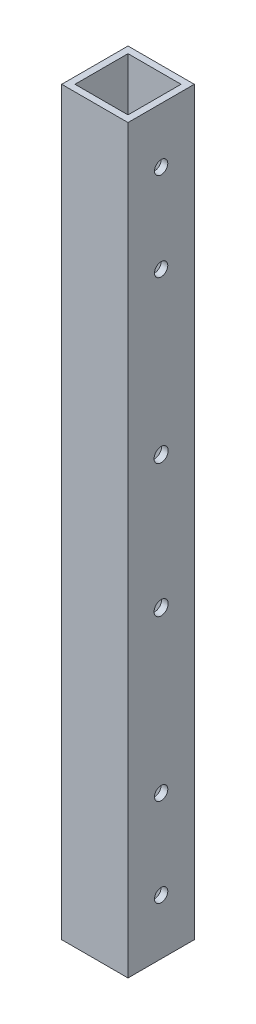
ISO-10303-21;
HEADER;
FILE_DESCRIPTION(('STEP AP214'),'2;1');
FILE_NAME('part.step','',(''),(''),'','','');
FILE_SCHEMA(('AUTOMOTIVE_DESIGN { 1 0 10303 214 1 1 1 1 }'));
ENDSEC;
DATA;
#1=APPLICATION_CONTEXT('core data for automotive mechanical design processes');
#2=APPLICATION_PROTOCOL_DEFINITION('international standard','automotive_design',2000,#1);
#3=PRODUCT_CONTEXT('',#1,'mechanical');
#4=PRODUCT('Part','Part','',(#3));
#5=PRODUCT_RELATED_PRODUCT_CATEGORY('part','',(#4));
#6=PRODUCT_DEFINITION_FORMATION('','',#4);
#7=PRODUCT_DEFINITION_CONTEXT('part definition',#1,'design');
#8=PRODUCT_DEFINITION('design','',#6,#7);
#9=PRODUCT_DEFINITION_SHAPE('','',#8);
#10=(LENGTH_UNIT() NAMED_UNIT(*) SI_UNIT(.MILLI.,.METRE.));
#11=(NAMED_UNIT(*) PLANE_ANGLE_UNIT() SI_UNIT($,.RADIAN.));
#12=(NAMED_UNIT(*) SI_UNIT($,.STERADIAN.) SOLID_ANGLE_UNIT());
#13=UNCERTAINTY_MEASURE_WITH_UNIT(LENGTH_MEASURE(1.E-05),#10,'distance_accuracy_value','');
#14=(GEOMETRIC_REPRESENTATION_CONTEXT(3) GLOBAL_UNCERTAINTY_ASSIGNED_CONTEXT((#13)) GLOBAL_UNIT_ASSIGNED_CONTEXT((#10,
#11,#12)) REPRESENTATION_CONTEXT('',''));
#15=CARTESIAN_POINT('',(0.,0.,0.));
#16=DIRECTION('',(0.,0.,1.));
#17=DIRECTION('',(1.,0.,0.));
#18=AXIS2_PLACEMENT_3D('',#15,#16,#17);
#19=CARTESIAN_POINT('',(0.,167.65,0.));
#20=DIRECTION('',(0.,-1.,0.));
#21=DIRECTION('',(0.,0.,-1.));
#22=AXIS2_PLACEMENT_3D('',#19,#20,#21);
#23=PLANE('',#22);
#24=DIRECTION('',(0.,0.,1.));
#25=VECTOR('',#24,1.);
#26=CARTESIAN_POINT('',(0.,167.65,0.));
#27=LINE('',#26,#25);
#28=CARTESIAN_POINT('',(0.,167.65,-15.));
#29=VERTEX_POINT('',#28);
#30=CARTESIAN_POINT('',(0.,167.65,0.));
#31=VERTEX_POINT('',#30);
#32=EDGE_CURVE('E150',#29,#31,#27,.T.);
#33=ORIENTED_EDGE('',*,*,#32,.T.);
#34=DIRECTION('',(1.,0.,0.));
#35=VECTOR('',#34,1.);
#36=CARTESIAN_POINT('',(0.,167.65,0.));
#37=LINE('',#36,#35);
#38=CARTESIAN_POINT('',(15.,167.65,0.));
#39=VERTEX_POINT('',#38);
#40=EDGE_CURVE('E153',#31,#39,#37,.T.);
#41=ORIENTED_EDGE('',*,*,#40,.T.);
#42=DIRECTION('',(0.,0.,-1.));
#43=VECTOR('',#42,1.);
#44=CARTESIAN_POINT('',(15.,167.65,0.));
#45=LINE('',#44,#43);
#46=CARTESIAN_POINT('',(15.,167.65,-15.));
#47=VERTEX_POINT('',#46);
#48=EDGE_CURVE('E156',#39,#47,#45,.T.);
#49=ORIENTED_EDGE('',*,*,#48,.T.);
#50=DIRECTION('',(-1.,0.,0.));
#51=VECTOR('',#50,1.);
#52=CARTESIAN_POINT('',(0.,167.65,-15.));
#53=LINE('',#52,#51);
#54=EDGE_CURVE('E158',#47,#29,#53,.T.);
#55=ORIENTED_EDGE('',*,*,#54,.T.);
#56=EDGE_LOOP('',(#33,#41,#49,#55));
#57=FACE_BOUND('',#56,.T.);
#58=DIRECTION('',(1.,0.,0.));
#59=VECTOR('',#58,1.);
#60=CARTESIAN_POINT('',(1.5,167.65,-1.5));
#61=LINE('',#60,#59);
#62=CARTESIAN_POINT('',(1.5,167.65,-1.5));
#63=VERTEX_POINT('',#62);
#64=CARTESIAN_POINT('',(13.5,167.65,-1.5));
#65=VERTEX_POINT('',#64);
#66=EDGE_CURVE('E112',#63,#65,#61,.T.);
#67=ORIENTED_EDGE('',*,*,#66,.F.);
#68=DIRECTION('',(0.,0.,1.));
#69=VECTOR('',#68,1.);
#70=CARTESIAN_POINT('',(1.5,167.65,-1.5));
#71=LINE('',#70,#69);
#72=CARTESIAN_POINT('',(1.5,167.65,-13.5));
#73=VERTEX_POINT('',#72);
#74=EDGE_CURVE('E134',#73,#63,#71,.T.);
#75=ORIENTED_EDGE('',*,*,#74,.F.);
#76=DIRECTION('',(-1.,0.,0.));
#77=VECTOR('',#76,1.);
#78=CARTESIAN_POINT('',(1.5,167.65,-13.5));
#79=LINE('',#78,#77);
#80=CARTESIAN_POINT('',(13.5,167.65,-13.5));
#81=VERTEX_POINT('',#80);
#82=EDGE_CURVE('E132',#81,#73,#79,.T.);
#83=ORIENTED_EDGE('',*,*,#82,.F.);
#84=DIRECTION('',(0.,0.,-1.));
#85=VECTOR('',#84,1.);
#86=CARTESIAN_POINT('',(13.5,167.65,-1.5));
#87=LINE('',#86,#85);
#88=EDGE_CURVE('E120',#65,#81,#87,.T.);
#89=ORIENTED_EDGE('',*,*,#88,.F.);
#90=EDGE_LOOP('',(#67,#75,#83,#89));
#91=FACE_BOUND('',#90,.T.);
#92=ADVANCED_FACE('F45',(#57,#91),#23,.F.);
#93=CARTESIAN_POINT('',(0.,0.,0.));
#94=DIRECTION('',(0.,-1.,0.));
#95=DIRECTION('',(0.,0.,-1.));
#96=AXIS2_PLACEMENT_3D('',#93,#94,#95);
#97=PLANE('',#96);
#98=DIRECTION('',(0.,0.,1.));
#99=VECTOR('',#98,1.);
#100=CARTESIAN_POINT('',(0.,0.,0.));
#101=LINE('',#100,#99);
#102=CARTESIAN_POINT('',(0.,0.,-15.));
#103=VERTEX_POINT('',#102);
#104=CARTESIAN_POINT('',(0.,0.,0.));
#105=VERTEX_POINT('',#104);
#106=EDGE_CURVE('E128',#103,#105,#101,.T.);
#107=ORIENTED_EDGE('',*,*,#106,.F.);
#108=DIRECTION('',(-1.,0.,0.));
#109=VECTOR('',#108,1.);
#110=CARTESIAN_POINT('',(0.,0.,-15.));
#111=LINE('',#110,#109);
#112=CARTESIAN_POINT('',(15.,0.,-15.));
#113=VERTEX_POINT('',#112);
#114=EDGE_CURVE('E154',#113,#103,#111,.T.);
#115=ORIENTED_EDGE('',*,*,#114,.F.);
#116=DIRECTION('',(0.,0.,-1.));
#117=VECTOR('',#116,1.);
#118=CARTESIAN_POINT('',(15.,0.,0.));
#119=LINE('',#118,#117);
#120=CARTESIAN_POINT('',(15.,0.,0.));
#121=VERTEX_POINT('',#120);
#122=EDGE_CURVE('E165',#121,#113,#119,.T.);
#123=ORIENTED_EDGE('',*,*,#122,.F.);
#124=DIRECTION('',(1.,0.,0.));
#125=VECTOR('',#124,1.);
#126=CARTESIAN_POINT('',(0.,0.,0.));
#127=LINE('',#126,#125);
#128=EDGE_CURVE('E163',#105,#121,#127,.T.);
#129=ORIENTED_EDGE('',*,*,#128,.F.);
#130=EDGE_LOOP('',(#107,#115,#123,#129));
#131=FACE_BOUND('',#130,.T.);
#132=DIRECTION('',(0.,0.,1.));
#133=VECTOR('',#132,1.);
#134=CARTESIAN_POINT('',(1.5,0.,-1.5));
#135=LINE('',#134,#133);
#136=CARTESIAN_POINT('',(1.5,0.,-13.5));
#137=VERTEX_POINT('',#136);
#138=CARTESIAN_POINT('',(1.5,0.,-1.5));
#139=VERTEX_POINT('',#138);
#140=EDGE_CURVE('E121',#137,#139,#135,.T.);
#141=ORIENTED_EDGE('',*,*,#140,.T.);
#142=DIRECTION('',(1.,0.,0.));
#143=VECTOR('',#142,1.);
#144=CARTESIAN_POINT('',(1.5,0.,-1.5));
#145=LINE('',#144,#143);
#146=CARTESIAN_POINT('',(13.5,0.,-1.5));
#147=VERTEX_POINT('',#146);
#148=EDGE_CURVE('E70',#139,#147,#145,.T.);
#149=ORIENTED_EDGE('',*,*,#148,.T.);
#150=DIRECTION('',(0.,0.,-1.));
#151=VECTOR('',#150,1.);
#152=CARTESIAN_POINT('',(13.5,0.,-1.5));
#153=LINE('',#152,#151);
#154=CARTESIAN_POINT('',(13.5,0.,-13.5));
#155=VERTEX_POINT('',#154);
#156=EDGE_CURVE('E127',#147,#155,#153,.T.);
#157=ORIENTED_EDGE('',*,*,#156,.T.);
#158=DIRECTION('',(-1.,0.,0.));
#159=VECTOR('',#158,1.);
#160=CARTESIAN_POINT('',(1.5,0.,-13.5));
#161=LINE('',#160,#159);
#162=EDGE_CURVE('E142',#155,#137,#161,.T.);
#163=ORIENTED_EDGE('',*,*,#162,.T.);
#164=EDGE_LOOP('',(#141,#149,#157,#163));
#165=FACE_BOUND('',#164,.T.);
#166=ADVANCED_FACE('F285',(#131,#165),#97,.T.);
#167=CARTESIAN_POINT('',(0.,167.65,0.));
#168=DIRECTION('',(1.,0.,0.));
#169=DIRECTION('',(0.,0.,-1.));
#170=AXIS2_PLACEMENT_3D('',#167,#168,#169);
#171=PLANE('',#170);
#172=CARTESIAN_POINT('',(0.,98.825,-7.49999999999998));
#173=DIRECTION('',(-1.,0.,0.));
#174=DIRECTION('',(0.,0.,1.));
#175=AXIS2_PLACEMENT_3D('',#172,#173,#174);
#176=CIRCLE('',#175,1.59999999999999);
#177=CARTESIAN_POINT('',(0.,98.825,-5.89999999999999));
#178=VERTEX_POINT('',#177);
#179=EDGE_CURVE('E199',#178,#178,#176,.T.);
#180=ORIENTED_EDGE('',*,*,#179,.F.);
#181=EDGE_LOOP('',(#180));
#182=FACE_BOUND('',#181,.T.);
#183=CARTESIAN_POINT('',(0.,68.825,-7.49999999999998));
#184=DIRECTION('',(-1.,0.,0.));
#185=DIRECTION('',(0.,0.,1.));
#186=AXIS2_PLACEMENT_3D('',#183,#184,#185);
#187=CIRCLE('',#186,1.59999999999999);
#188=CARTESIAN_POINT('',(0.,68.825,-5.89999999999999));
#189=VERTEX_POINT('',#188);
#190=EDGE_CURVE('E204',#189,#189,#187,.T.);
#191=ORIENTED_EDGE('',*,*,#190,.F.);
#192=EDGE_LOOP('',(#191));
#193=FACE_BOUND('',#192,.T.);
#194=CARTESIAN_POINT('',(0.,155.15,-7.50000000000201));
#195=DIRECTION('',(-1.,0.,0.));
#196=DIRECTION('',(0.,0.,1.));
#197=AXIS2_PLACEMENT_3D('',#194,#195,#196);
#198=CIRCLE('',#197,1.50000000000191);
#199=CARTESIAN_POINT('',(0.,155.15,-6.00000000000009));
#200=VERTEX_POINT('',#199);
#201=EDGE_CURVE('E218',#200,#200,#198,.T.);
#202=ORIENTED_EDGE('',*,*,#201,.F.);
#203=EDGE_LOOP('',(#202));
#204=FACE_BOUND('',#203,.T.);
#205=CARTESIAN_POINT('',(0.,135.15,-7.50000000000201));
#206=DIRECTION('',(-1.,0.,0.));
#207=DIRECTION('',(0.,0.,1.));
#208=AXIS2_PLACEMENT_3D('',#205,#206,#207);
#209=CIRCLE('',#208,1.50000000000191);
#210=CARTESIAN_POINT('',(0.,135.15,-6.0000000000001));
#211=VERTEX_POINT('',#210);
#212=EDGE_CURVE('E221',#211,#211,#209,.T.);
#213=ORIENTED_EDGE('',*,*,#212,.F.);
#214=EDGE_LOOP('',(#213));
#215=FACE_BOUND('',#214,.T.);
#216=CARTESIAN_POINT('',(0.,32.4999999999964,-7.50000000000201));
#217=DIRECTION('',(-1.,0.,0.));
#218=DIRECTION('',(0.,0.,1.));
#219=AXIS2_PLACEMENT_3D('',#216,#217,#218);
#220=CIRCLE('',#219,1.5);
#221=CARTESIAN_POINT('',(0.,32.4999999999964,-6.000000000002));
#222=VERTEX_POINT('',#221);
#223=EDGE_CURVE('E227',#222,#222,#220,.T.);
#224=ORIENTED_EDGE('',*,*,#223,.F.);
#225=EDGE_LOOP('',(#224));
#226=FACE_BOUND('',#225,.T.);
#227=CARTESIAN_POINT('',(0.,12.4999999999964,-7.50000000000201));
#228=DIRECTION('',(-1.,0.,0.));
#229=DIRECTION('',(0.,0.,1.));
#230=AXIS2_PLACEMENT_3D('',#227,#228,#229);
#231=CIRCLE('',#230,1.5);
#232=CARTESIAN_POINT('',(0.,12.4999999999964,-6.000000000002));
#233=VERTEX_POINT('',#232);
#234=EDGE_CURVE('E233',#233,#233,#231,.T.);
#235=ORIENTED_EDGE('',*,*,#234,.F.);
#236=EDGE_LOOP('',(#235));
#237=FACE_BOUND('',#236,.T.);
#238=ORIENTED_EDGE('',*,*,#106,.T.);
#239=DIRECTION('',(0.,-1.,0.));
#240=VECTOR('',#239,1.);
#241=CARTESIAN_POINT('',(0.,167.65,0.));
#242=LINE('',#241,#240);
#243=EDGE_CURVE('E11',#31,#105,#242,.T.);
#244=ORIENTED_EDGE('',*,*,#243,.F.);
#245=ORIENTED_EDGE('',*,*,#32,.F.);
#246=DIRECTION('',(0.,-1.,0.));
#247=VECTOR('',#246,1.);
#248=CARTESIAN_POINT('',(0.,167.65,-15.));
#249=LINE('',#248,#247);
#250=EDGE_CURVE('E160',#29,#103,#249,.T.);
#251=ORIENTED_EDGE('',*,*,#250,.T.);
#252=EDGE_LOOP('',(#238,#244,#245,#251));
#253=FACE_BOUND('',#252,.T.);
#254=ADVANCED_FACE('F47',(#182,#193,#204,#215,#226,#237,#253),#171,.F.);
#255=CARTESIAN_POINT('',(0.,167.65,0.));
#256=DIRECTION('',(0.,0.,-1.));
#257=DIRECTION('',(-1.,0.,0.));
#258=AXIS2_PLACEMENT_3D('',#255,#256,#257);
#259=PLANE('',#258);
#260=ORIENTED_EDGE('',*,*,#128,.T.);
#261=DIRECTION('',(0.,-1.,0.));
#262=VECTOR('',#261,1.);
#263=CARTESIAN_POINT('',(15.,167.65,0.));
#264=LINE('',#263,#262);
#265=EDGE_CURVE('E54',#39,#121,#264,.T.);
#266=ORIENTED_EDGE('',*,*,#265,.F.);
#267=ORIENTED_EDGE('',*,*,#40,.F.);
#268=ORIENTED_EDGE('',*,*,#243,.T.);
#269=EDGE_LOOP('',(#260,#266,#267,#268));
#270=FACE_BOUND('',#269,.T.);
#271=ADVANCED_FACE('F273',(#270),#259,.F.);
#272=CARTESIAN_POINT('',(15.,167.65,0.));
#273=DIRECTION('',(-1.,0.,0.));
#274=DIRECTION('',(0.,0.,1.));
#275=AXIS2_PLACEMENT_3D('',#272,#273,#274);
#276=PLANE('',#275);
#277=CARTESIAN_POINT('',(15.,98.825,-7.49999999999998));
#278=DIRECTION('',(-1.,0.,0.));
#279=DIRECTION('',(0.,0.,1.));
#280=AXIS2_PLACEMENT_3D('',#277,#278,#279);
#281=CIRCLE('',#280,1.59999999999999);
#282=CARTESIAN_POINT('',(15.,98.825,-5.89999999999999));
#283=VERTEX_POINT('',#282);
#284=EDGE_CURVE('E193',#283,#283,#281,.T.);
#285=ORIENTED_EDGE('',*,*,#284,.T.);
#286=EDGE_LOOP('',(#285));
#287=FACE_BOUND('',#286,.T.);
#288=CARTESIAN_POINT('',(15.,68.825,-7.49999999999998));
#289=DIRECTION('',(-1.,0.,0.));
#290=DIRECTION('',(0.,0.,1.));
#291=AXIS2_PLACEMENT_3D('',#288,#289,#290);
#292=CIRCLE('',#291,1.59999999999999);
#293=CARTESIAN_POINT('',(15.,68.825,-5.89999999999999));
#294=VERTEX_POINT('',#293);
#295=EDGE_CURVE('E209',#294,#294,#292,.T.);
#296=ORIENTED_EDGE('',*,*,#295,.T.);
#297=EDGE_LOOP('',(#296));
#298=FACE_BOUND('',#297,.T.);
#299=CARTESIAN_POINT('',(15.,155.15,-7.50000000000201));
#300=DIRECTION('',(-1.,0.,0.));
#301=DIRECTION('',(0.,0.,1.));
#302=AXIS2_PLACEMENT_3D('',#299,#300,#301);
#303=CIRCLE('',#302,1.50000000000191);
#304=CARTESIAN_POINT('',(15.,155.15,-6.00000000000009));
#305=VERTEX_POINT('',#304);
#306=EDGE_CURVE('E179',#305,#305,#303,.T.);
#307=ORIENTED_EDGE('',*,*,#306,.T.);
#308=EDGE_LOOP('',(#307));
#309=FACE_BOUND('',#308,.T.);
#310=CARTESIAN_POINT('',(15.,135.15,-7.50000000000201));
#311=DIRECTION('',(-1.,0.,0.));
#312=DIRECTION('',(0.,0.,1.));
#313=AXIS2_PLACEMENT_3D('',#310,#311,#312);
#314=CIRCLE('',#313,1.50000000000191);
#315=CARTESIAN_POINT('',(15.,135.15,-6.0000000000001));
#316=VERTEX_POINT('',#315);
#317=EDGE_CURVE('E224',#316,#316,#314,.T.);
#318=ORIENTED_EDGE('',*,*,#317,.T.);
#319=EDGE_LOOP('',(#318));
#320=FACE_BOUND('',#319,.T.);
#321=CARTESIAN_POINT('',(15.,32.4999999999964,-7.50000000000201));
#322=DIRECTION('',(-1.,0.,0.));
#323=DIRECTION('',(0.,0.,1.));
#324=AXIS2_PLACEMENT_3D('',#321,#322,#323);
#325=CIRCLE('',#324,1.5);
#326=CARTESIAN_POINT('',(15.,32.4999999999964,-6.000000000002));
#327=VERTEX_POINT('',#326);
#328=EDGE_CURVE('E230',#327,#327,#325,.T.);
#329=ORIENTED_EDGE('',*,*,#328,.T.);
#330=EDGE_LOOP('',(#329));
#331=FACE_BOUND('',#330,.T.);
#332=CARTESIAN_POINT('',(15.,12.4999999999964,-7.50000000000201));
#333=DIRECTION('',(-1.,0.,0.));
#334=DIRECTION('',(0.,0.,1.));
#335=AXIS2_PLACEMENT_3D('',#332,#333,#334);
#336=CIRCLE('',#335,1.5);
#337=CARTESIAN_POINT('',(15.,12.4999999999964,-6.000000000002));
#338=VERTEX_POINT('',#337);
#339=EDGE_CURVE('E215',#338,#338,#336,.T.);
#340=ORIENTED_EDGE('',*,*,#339,.T.);
#341=EDGE_LOOP('',(#340));
#342=FACE_BOUND('',#341,.T.);
#343=ORIENTED_EDGE('',*,*,#122,.T.);
#344=DIRECTION('',(0.,-1.,0.));
#345=VECTOR('',#344,1.);
#346=CARTESIAN_POINT('',(15.,167.65,-15.));
#347=LINE('',#346,#345);
#348=EDGE_CURVE('E170',#47,#113,#347,.T.);
#349=ORIENTED_EDGE('',*,*,#348,.F.);
#350=ORIENTED_EDGE('',*,*,#48,.F.);
#351=ORIENTED_EDGE('',*,*,#265,.T.);
#352=EDGE_LOOP('',(#343,#349,#350,#351));
#353=FACE_BOUND('',#352,.T.);
#354=ADVANCED_FACE('F269',(#287,#298,#309,#320,#331,#342,#353),#276,.F.);
#355=CARTESIAN_POINT('',(0.,167.65,-15.));
#356=DIRECTION('',(0.,0.,1.));
#357=DIRECTION('',(1.,0.,0.));
#358=AXIS2_PLACEMENT_3D('',#355,#356,#357);
#359=PLANE('',#358);
#360=ORIENTED_EDGE('',*,*,#114,.T.);
#361=ORIENTED_EDGE('',*,*,#250,.F.);
#362=ORIENTED_EDGE('',*,*,#54,.F.);
#363=ORIENTED_EDGE('',*,*,#348,.T.);
#364=EDGE_LOOP('',(#360,#361,#362,#363));
#365=FACE_BOUND('',#364,.T.);
#366=ADVANCED_FACE('F272',(#365),#359,.F.);
#367=CARTESIAN_POINT('',(1.5,167.65,-1.5));
#368=DIRECTION('',(0.,0.,-1.));
#369=DIRECTION('',(-1.,0.,0.));
#370=AXIS2_PLACEMENT_3D('',#367,#368,#369);
#371=PLANE('',#370);
#372=ORIENTED_EDGE('',*,*,#148,.F.);
#373=DIRECTION('',(0.,-1.,0.));
#374=VECTOR('',#373,1.);
#375=CARTESIAN_POINT('',(1.5,167.65,-1.5));
#376=LINE('',#375,#374);
#377=EDGE_CURVE('E116',#63,#139,#376,.T.);
#378=ORIENTED_EDGE('',*,*,#377,.F.);
#379=ORIENTED_EDGE('',*,*,#66,.T.);
#380=DIRECTION('',(0.,-1.,0.));
#381=VECTOR('',#380,1.);
#382=CARTESIAN_POINT('',(13.5,167.65,-1.5));
#383=LINE('',#382,#381);
#384=EDGE_CURVE('E115',#65,#147,#383,.T.);
#385=ORIENTED_EDGE('',*,*,#384,.T.);
#386=EDGE_LOOP('',(#372,#378,#379,#385));
#387=FACE_BOUND('',#386,.T.);
#388=ADVANCED_FACE('F114',(#387),#371,.T.);
#389=CARTESIAN_POINT('',(13.5,167.65,-1.5));
#390=DIRECTION('',(-1.,0.,0.));
#391=DIRECTION('',(0.,0.,1.));
#392=AXIS2_PLACEMENT_3D('',#389,#390,#391);
#393=PLANE('',#392);
#394=CARTESIAN_POINT('',(13.5,98.825,-7.49999999999998));
#395=DIRECTION('',(-1.,0.,0.));
#396=DIRECTION('',(0.,0.,1.));
#397=AXIS2_PLACEMENT_3D('',#394,#395,#396);
#398=CIRCLE('',#397,1.59999999999999);
#399=CARTESIAN_POINT('',(13.5,98.825,-5.89999999999999));
#400=VERTEX_POINT('',#399);
#401=EDGE_CURVE('E212',#400,#400,#398,.T.);
#402=ORIENTED_EDGE('',*,*,#401,.F.);
#403=EDGE_LOOP('',(#402));
#404=FACE_BOUND('',#403,.T.);
#405=CARTESIAN_POINT('',(13.5,68.825,-7.49999999999998));
#406=DIRECTION('',(-1.,0.,0.));
#407=DIRECTION('',(0.,0.,1.));
#408=AXIS2_PLACEMENT_3D('',#405,#406,#407);
#409=CIRCLE('',#408,1.59999999999999);
#410=CARTESIAN_POINT('',(13.5,68.825,-5.89999999999999));
#411=VERTEX_POINT('',#410);
#412=EDGE_CURVE('E192',#411,#411,#409,.T.);
#413=ORIENTED_EDGE('',*,*,#412,.F.);
#414=EDGE_LOOP('',(#413));
#415=FACE_BOUND('',#414,.T.);
#416=CARTESIAN_POINT('',(13.5,155.15,-7.50000000000201));
#417=DIRECTION('',(-1.,0.,0.));
#418=DIRECTION('',(0.,0.,1.));
#419=AXIS2_PLACEMENT_3D('',#416,#417,#418);
#420=CIRCLE('',#419,1.50000000000191);
#421=CARTESIAN_POINT('',(13.5,155.15,-6.00000000000009));
#422=VERTEX_POINT('',#421);
#423=EDGE_CURVE('E140',#422,#422,#420,.T.);
#424=ORIENTED_EDGE('',*,*,#423,.F.);
#425=EDGE_LOOP('',(#424));
#426=FACE_BOUND('',#425,.T.);
#427=CARTESIAN_POINT('',(13.5,135.15,-7.50000000000201));
#428=DIRECTION('',(-1.,0.,0.));
#429=DIRECTION('',(0.,0.,1.));
#430=AXIS2_PLACEMENT_3D('',#427,#428,#429);
#431=CIRCLE('',#430,1.50000000000191);
#432=CARTESIAN_POINT('',(13.5,135.15,-6.0000000000001));
#433=VERTEX_POINT('',#432);
#434=EDGE_CURVE('E187',#433,#433,#431,.T.);
#435=ORIENTED_EDGE('',*,*,#434,.F.);
#436=EDGE_LOOP('',(#435));
#437=FACE_BOUND('',#436,.T.);
#438=CARTESIAN_POINT('',(13.5,32.4999999999964,-7.50000000000201));
#439=DIRECTION('',(-1.,0.,0.));
#440=DIRECTION('',(0.,0.,1.));
#441=AXIS2_PLACEMENT_3D('',#438,#439,#440);
#442=CIRCLE('',#441,1.5);
#443=CARTESIAN_POINT('',(13.5,32.4999999999964,-6.000000000002));
#444=VERTEX_POINT('',#443);
#445=EDGE_CURVE('E183',#444,#444,#442,.T.);
#446=ORIENTED_EDGE('',*,*,#445,.F.);
#447=EDGE_LOOP('',(#446));
#448=FACE_BOUND('',#447,.T.);
#449=CARTESIAN_POINT('',(13.5,12.4999999999964,-7.50000000000201));
#450=DIRECTION('',(-1.,0.,0.));
#451=DIRECTION('',(0.,0.,1.));
#452=AXIS2_PLACEMENT_3D('',#449,#450,#451);
#453=CIRCLE('',#452,1.5);
#454=CARTESIAN_POINT('',(13.5,12.4999999999964,-6.000000000002));
#455=VERTEX_POINT('',#454);
#456=EDGE_CURVE('E178',#455,#455,#453,.T.);
#457=ORIENTED_EDGE('',*,*,#456,.F.);
#458=EDGE_LOOP('',(#457));
#459=FACE_BOUND('',#458,.T.);
#460=ORIENTED_EDGE('',*,*,#156,.F.);
#461=ORIENTED_EDGE('',*,*,#384,.F.);
#462=ORIENTED_EDGE('',*,*,#88,.T.);
#463=DIRECTION('',(0.,-1.,0.));
#464=VECTOR('',#463,1.);
#465=CARTESIAN_POINT('',(13.5,167.65,-13.5));
#466=LINE('',#465,#464);
#467=EDGE_CURVE('E129',#81,#155,#466,.T.);
#468=ORIENTED_EDGE('',*,*,#467,.T.);
#469=EDGE_LOOP('',(#460,#461,#462,#468));
#470=FACE_BOUND('',#469,.T.);
#471=ADVANCED_FACE('F124',(#404,#415,#426,#437,#448,#459,#470),#393,.T.);
#472=CARTESIAN_POINT('',(1.5,167.65,-13.5));
#473=DIRECTION('',(0.,0.,1.));
#474=DIRECTION('',(1.,0.,0.));
#475=AXIS2_PLACEMENT_3D('',#472,#473,#474);
#476=PLANE('',#475);
#477=ORIENTED_EDGE('',*,*,#162,.F.);
#478=ORIENTED_EDGE('',*,*,#467,.F.);
#479=ORIENTED_EDGE('',*,*,#82,.T.);
#480=DIRECTION('',(0.,-1.,0.));
#481=VECTOR('',#480,1.);
#482=CARTESIAN_POINT('',(1.5,167.65,-13.5));
#483=LINE('',#482,#481);
#484=EDGE_CURVE('E62',#73,#137,#483,.T.);
#485=ORIENTED_EDGE('',*,*,#484,.T.);
#486=EDGE_LOOP('',(#477,#478,#479,#485));
#487=FACE_BOUND('',#486,.T.);
#488=ADVANCED_FACE('F251',(#487),#476,.T.);
#489=CARTESIAN_POINT('',(1.5,167.65,-1.5));
#490=DIRECTION('',(1.,0.,0.));
#491=DIRECTION('',(0.,0.,-1.));
#492=AXIS2_PLACEMENT_3D('',#489,#490,#491);
#493=PLANE('',#492);
#494=CARTESIAN_POINT('',(1.5,98.825,-7.49999999999998));
#495=DIRECTION('',(1.,0.,0.));
#496=DIRECTION('',(0.,0.,-1.));
#497=AXIS2_PLACEMENT_3D('',#494,#495,#496);
#498=CIRCLE('',#497,1.59999999999999);
#499=CARTESIAN_POINT('',(1.5,98.825,-9.09999999999997));
#500=VERTEX_POINT('',#499);
#501=EDGE_CURVE('E49',#500,#500,#498,.T.);
#502=ORIENTED_EDGE('',*,*,#501,.F.);
#503=EDGE_LOOP('',(#502));
#504=FACE_BOUND('',#503,.T.);
#505=CARTESIAN_POINT('',(1.5,68.825,-7.49999999999998));
#506=DIRECTION('',(1.,0.,0.));
#507=DIRECTION('',(0.,0.,-1.));
#508=AXIS2_PLACEMENT_3D('',#505,#506,#507);
#509=CIRCLE('',#508,1.59999999999999);
#510=CARTESIAN_POINT('',(1.5,68.825,-9.09999999999997));
#511=VERTEX_POINT('',#510);
#512=EDGE_CURVE('E190',#511,#511,#509,.T.);
#513=ORIENTED_EDGE('',*,*,#512,.F.);
#514=EDGE_LOOP('',(#513));
#515=FACE_BOUND('',#514,.T.);
#516=CARTESIAN_POINT('',(1.5,155.15,-7.50000000000201));
#517=DIRECTION('',(1.,0.,0.));
#518=DIRECTION('',(0.,0.,-1.));
#519=AXIS2_PLACEMENT_3D('',#516,#517,#518);
#520=CIRCLE('',#519,1.50000000000191);
#521=CARTESIAN_POINT('',(1.5,155.15,-9.00000000000392));
#522=VERTEX_POINT('',#521);
#523=EDGE_CURVE('E188',#522,#522,#520,.T.);
#524=ORIENTED_EDGE('',*,*,#523,.F.);
#525=EDGE_LOOP('',(#524));
#526=FACE_BOUND('',#525,.T.);
#527=CARTESIAN_POINT('',(1.5,135.15,-7.50000000000201));
#528=DIRECTION('',(1.,0.,0.));
#529=DIRECTION('',(0.,0.,-1.));
#530=AXIS2_PLACEMENT_3D('',#527,#528,#529);
#531=CIRCLE('',#530,1.50000000000191);
#532=CARTESIAN_POINT('',(1.5,135.15,-9.00000000000391));
#533=VERTEX_POINT('',#532);
#534=EDGE_CURVE('E184',#533,#533,#531,.T.);
#535=ORIENTED_EDGE('',*,*,#534,.F.);
#536=EDGE_LOOP('',(#535));
#537=FACE_BOUND('',#536,.T.);
#538=CARTESIAN_POINT('',(1.5,32.4999999999964,-7.50000000000201));
#539=DIRECTION('',(1.,0.,0.));
#540=DIRECTION('',(0.,0.,-1.));
#541=AXIS2_PLACEMENT_3D('',#538,#539,#540);
#542=CIRCLE('',#541,1.5);
#543=CARTESIAN_POINT('',(1.5,32.4999999999964,-9.00000000000201));
#544=VERTEX_POINT('',#543);
#545=EDGE_CURVE('E180',#544,#544,#542,.T.);
#546=ORIENTED_EDGE('',*,*,#545,.F.);
#547=EDGE_LOOP('',(#546));
#548=FACE_BOUND('',#547,.T.);
#549=CARTESIAN_POINT('',(1.5,12.4999999999964,-7.50000000000201));
#550=DIRECTION('',(1.,0.,0.));
#551=DIRECTION('',(0.,0.,-1.));
#552=AXIS2_PLACEMENT_3D('',#549,#550,#551);
#553=CIRCLE('',#552,1.5);
#554=CARTESIAN_POINT('',(1.5,12.4999999999964,-9.00000000000201));
#555=VERTEX_POINT('',#554);
#556=EDGE_CURVE('E175',#555,#555,#553,.T.);
#557=ORIENTED_EDGE('',*,*,#556,.F.);
#558=EDGE_LOOP('',(#557));
#559=FACE_BOUND('',#558,.T.);
#560=ORIENTED_EDGE('',*,*,#140,.F.);
#561=ORIENTED_EDGE('',*,*,#484,.F.);
#562=ORIENTED_EDGE('',*,*,#74,.T.);
#563=ORIENTED_EDGE('',*,*,#377,.T.);
#564=EDGE_LOOP('',(#560,#561,#562,#563));
#565=FACE_BOUND('',#564,.T.);
#566=ADVANCED_FACE('F319',(#504,#515,#526,#537,#548,#559,#565),#493,.T.);
#567=CARTESIAN_POINT('',(15.,12.4999999999964,-7.50000000000201));
#568=DIRECTION('',(-1.,0.,0.));
#569=DIRECTION('',(0.,0.,1.));
#570=AXIS2_PLACEMENT_3D('',#567,#568,#569);
#571=CYLINDRICAL_SURFACE('',#570,1.5);
#572=ORIENTED_EDGE('',*,*,#556,.T.);
#573=EDGE_LOOP('',(#572));
#574=FACE_BOUND('',#573,.T.);
#575=ORIENTED_EDGE('',*,*,#234,.T.);
#576=EDGE_LOOP('',(#575));
#577=FACE_BOUND('',#576,.T.);
#578=ADVANCED_FACE('F266',(#574,#577),#571,.F.);
#579=CARTESIAN_POINT('',(15.,32.4999999999964,-7.50000000000201));
#580=DIRECTION('',(-1.,0.,0.));
#581=DIRECTION('',(0.,0.,1.));
#582=AXIS2_PLACEMENT_3D('',#579,#580,#581);
#583=CYLINDRICAL_SURFACE('',#582,1.5);
#584=ORIENTED_EDGE('',*,*,#545,.T.);
#585=EDGE_LOOP('',(#584));
#586=FACE_BOUND('',#585,.T.);
#587=ORIENTED_EDGE('',*,*,#223,.T.);
#588=EDGE_LOOP('',(#587));
#589=FACE_BOUND('',#588,.T.);
#590=ADVANCED_FACE('F329',(#586,#589),#583,.F.);
#591=CARTESIAN_POINT('',(15.,135.15,-7.50000000000201));
#592=DIRECTION('',(-1.,0.,0.));
#593=DIRECTION('',(0.,0.,1.));
#594=AXIS2_PLACEMENT_3D('',#591,#592,#593);
#595=CYLINDRICAL_SURFACE('',#594,1.50000000000191);
#596=ORIENTED_EDGE('',*,*,#534,.T.);
#597=EDGE_LOOP('',(#596));
#598=FACE_BOUND('',#597,.T.);
#599=ORIENTED_EDGE('',*,*,#212,.T.);
#600=EDGE_LOOP('',(#599));
#601=FACE_BOUND('',#600,.T.);
#602=ADVANCED_FACE('F337',(#598,#601),#595,.F.);
#603=CARTESIAN_POINT('',(15.,155.15,-7.50000000000201));
#604=DIRECTION('',(-1.,0.,0.));
#605=DIRECTION('',(0.,0.,1.));
#606=AXIS2_PLACEMENT_3D('',#603,#604,#605);
#607=CYLINDRICAL_SURFACE('',#606,1.50000000000191);
#608=ORIENTED_EDGE('',*,*,#523,.T.);
#609=EDGE_LOOP('',(#608));
#610=FACE_BOUND('',#609,.T.);
#611=ORIENTED_EDGE('',*,*,#201,.T.);
#612=EDGE_LOOP('',(#611));
#613=FACE_BOUND('',#612,.T.);
#614=ADVANCED_FACE('F264',(#610,#613),#607,.F.);
#615=ORIENTED_EDGE('',*,*,#456,.T.);
#616=EDGE_LOOP('',(#615));
#617=FACE_BOUND('',#616,.T.);
#618=ORIENTED_EDGE('',*,*,#339,.F.);
#619=EDGE_LOOP('',(#618));
#620=FACE_BOUND('',#619,.T.);
#621=ADVANCED_FACE('F260',(#617,#620),#571,.F.);
#622=ORIENTED_EDGE('',*,*,#445,.T.);
#623=EDGE_LOOP('',(#622));
#624=FACE_BOUND('',#623,.T.);
#625=ORIENTED_EDGE('',*,*,#328,.F.);
#626=EDGE_LOOP('',(#625));
#627=FACE_BOUND('',#626,.T.);
#628=ADVANCED_FACE('F263',(#624,#627),#583,.F.);
#629=ORIENTED_EDGE('',*,*,#434,.T.);
#630=EDGE_LOOP('',(#629));
#631=FACE_BOUND('',#630,.T.);
#632=ORIENTED_EDGE('',*,*,#317,.F.);
#633=EDGE_LOOP('',(#632));
#634=FACE_BOUND('',#633,.T.);
#635=ADVANCED_FACE('F348',(#631,#634),#595,.F.);
#636=ORIENTED_EDGE('',*,*,#423,.T.);
#637=EDGE_LOOP('',(#636));
#638=FACE_BOUND('',#637,.T.);
#639=ORIENTED_EDGE('',*,*,#306,.F.);
#640=EDGE_LOOP('',(#639));
#641=FACE_BOUND('',#640,.T.);
#642=ADVANCED_FACE('F246',(#638,#641),#607,.F.);
#643=CARTESIAN_POINT('',(15.,68.825,-7.49999999999998));
#644=DIRECTION('',(-1.,0.,0.));
#645=DIRECTION('',(0.,0.,1.));
#646=AXIS2_PLACEMENT_3D('',#643,#644,#645);
#647=CYLINDRICAL_SURFACE('',#646,1.59999999999999);
#648=ORIENTED_EDGE('',*,*,#512,.T.);
#649=EDGE_LOOP('',(#648));
#650=FACE_BOUND('',#649,.T.);
#651=ORIENTED_EDGE('',*,*,#190,.T.);
#652=EDGE_LOOP('',(#651));
#653=FACE_BOUND('',#652,.T.);
#654=ADVANCED_FACE('F381',(#650,#653),#647,.F.);
#655=CARTESIAN_POINT('',(15.,98.825,-7.49999999999998));
#656=DIRECTION('',(-1.,0.,0.));
#657=DIRECTION('',(0.,0.,1.));
#658=AXIS2_PLACEMENT_3D('',#655,#656,#657);
#659=CYLINDRICAL_SURFACE('',#658,1.59999999999999);
#660=ORIENTED_EDGE('',*,*,#501,.T.);
#661=EDGE_LOOP('',(#660));
#662=FACE_BOUND('',#661,.T.);
#663=ORIENTED_EDGE('',*,*,#179,.T.);
#664=EDGE_LOOP('',(#663));
#665=FACE_BOUND('',#664,.T.);
#666=ADVANCED_FACE('F411',(#662,#665),#659,.F.);
#667=ORIENTED_EDGE('',*,*,#412,.T.);
#668=EDGE_LOOP('',(#667));
#669=FACE_BOUND('',#668,.T.);
#670=ORIENTED_EDGE('',*,*,#295,.F.);
#671=EDGE_LOOP('',(#670));
#672=FACE_BOUND('',#671,.T.);
#673=ADVANCED_FACE('F413',(#669,#672),#647,.F.);
#674=ORIENTED_EDGE('',*,*,#401,.T.);
#675=EDGE_LOOP('',(#674));
#676=FACE_BOUND('',#675,.T.);
#677=ORIENTED_EDGE('',*,*,#284,.F.);
#678=EDGE_LOOP('',(#677));
#679=FACE_BOUND('',#678,.T.);
#680=ADVANCED_FACE('F422',(#676,#679),#659,.F.);
#681=CLOSED_SHELL('',(#92,#166,#254,#271,#354,#366,#388,#471,#488,#566,#578,#590,#602,#614,#621,
#628,#635,#642,#654,#666,#673,#680));
#682=MANIFOLD_SOLID_BREP('B2',#681);
#683=ADVANCED_BREP_SHAPE_REPRESENTATION('',(#18,#682),#14);
#684=SHAPE_DEFINITION_REPRESENTATION(#9,#683);
ENDSEC;
END-ISO-10303-21;
